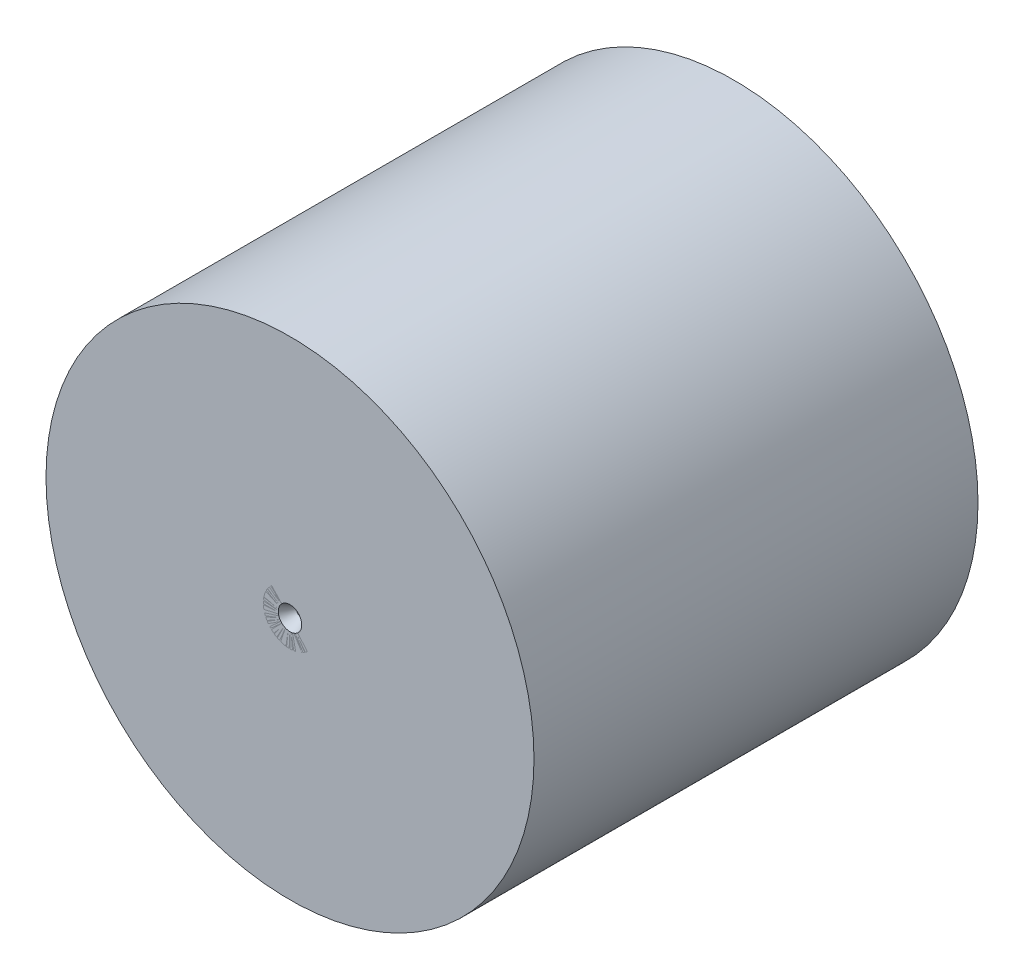
ISO-10303-21;
HEADER;
FILE_DESCRIPTION(('STEP AP214'),'2;1');
FILE_NAME('part.step','',(''),(''),'','','');
FILE_SCHEMA(('AUTOMOTIVE_DESIGN { 1 0 10303 214 1 1 1 1 }'));
ENDSEC;
DATA;
#1=APPLICATION_CONTEXT('core data for automotive mechanical design processes');
#2=APPLICATION_PROTOCOL_DEFINITION('international standard','automotive_design',2000,#1);
#3=PRODUCT_CONTEXT('',#1,'mechanical');
#4=PRODUCT('Part','Part','',(#3));
#5=PRODUCT_RELATED_PRODUCT_CATEGORY('part','',(#4));
#6=PRODUCT_DEFINITION_FORMATION('','',#4);
#7=PRODUCT_DEFINITION_CONTEXT('part definition',#1,'design');
#8=PRODUCT_DEFINITION('design','',#6,#7);
#9=PRODUCT_DEFINITION_SHAPE('','',#8);
#10=(LENGTH_UNIT() NAMED_UNIT(*) SI_UNIT(.MILLI.,.METRE.));
#11=(NAMED_UNIT(*) PLANE_ANGLE_UNIT() SI_UNIT($,.RADIAN.));
#12=(NAMED_UNIT(*) SI_UNIT($,.STERADIAN.) SOLID_ANGLE_UNIT());
#13=UNCERTAINTY_MEASURE_WITH_UNIT(LENGTH_MEASURE(1.E-05),#10,'distance_accuracy_value','');
#14=(GEOMETRIC_REPRESENTATION_CONTEXT(3) GLOBAL_UNCERTAINTY_ASSIGNED_CONTEXT((#13)) GLOBAL_UNIT_ASSIGNED_CONTEXT((#10,
#11,#12)) REPRESENTATION_CONTEXT('',''));
#15=CARTESIAN_POINT('',(0.,0.,0.));
#16=DIRECTION('',(0.,0.,1.));
#17=DIRECTION('',(1.,0.,0.));
#18=AXIS2_PLACEMENT_3D('',#15,#16,#17);
#19=CARTESIAN_POINT('',(0.,0.,-165.644610179245));
#20=DIRECTION('',(0.,0.,1.));
#21=DIRECTION('',(1.,0.,0.));
#22=AXIS2_PLACEMENT_3D('',#19,#20,#21);
#23=CYLINDRICAL_SURFACE('',#22,57.15);
#24=CARTESIAN_POINT('',(0.,0.,-2.));
#25=DIRECTION('',(0.,0.,1.));
#26=DIRECTION('',(1.,0.,0.));
#27=AXIS2_PLACEMENT_3D('',#24,#25,#26);
#28=CIRCLE('',#27,57.15);
#29=CARTESIAN_POINT('',(57.15,0.,-2.));
#30=VERTEX_POINT('',#29);
#31=EDGE_CURVE('E75',#30,#30,#28,.F.);
#32=CARTESIAN_POINT('',(0.,0.,101.9999996618));
#33=DIRECTION('',(0.,0.,1.));
#34=DIRECTION('',(1.,0.,0.));
#35=AXIS2_PLACEMENT_3D('',#32,#33,#34);
#36=CIRCLE('',#35,57.15);
#37=CARTESIAN_POINT('',(57.15,0.,101.9999996618));
#38=VERTEX_POINT('',#37);
#39=EDGE_CURVE('E14',#38,#38,#36,.F.);
#40=CARTESIAN_POINT('',(57.15,0.,-2.));
#41=CARTESIAN_POINT('',(57.15,0.,-0.91666667018958));
#42=CARTESIAN_POINT('',(57.15,0.,0.16666665962084));
#43=CARTESIAN_POINT('',(57.15,0.,2.33333331924167));
#44=CARTESIAN_POINT('',(57.15,0.,3.41666664905208));
#45=CARTESIAN_POINT('',(57.15,0.,5.58333330867291));
#46=CARTESIAN_POINT('',(57.15,0.,6.66666663848332));
#47=CARTESIAN_POINT('',(57.15,0.,8.83333329810415));
#48=CARTESIAN_POINT('',(57.15,0.,9.91666662791457));
#49=CARTESIAN_POINT('',(57.15,0.,12.0833332875354));
#50=CARTESIAN_POINT('',(57.15,0.,13.1666666173458));
#51=CARTESIAN_POINT('',(57.15,0.,15.3333332769667));
#52=CARTESIAN_POINT('',(57.15,0.,16.4166666067771));
#53=CARTESIAN_POINT('',(57.15,0.,18.5833332663979));
#54=CARTESIAN_POINT('',(57.15,0.,19.6666665962083));
#55=CARTESIAN_POINT('',(57.15,0.,21.8333332558291));
#56=CARTESIAN_POINT('',(57.15,0.,22.9166665856396));
#57=CARTESIAN_POINT('',(57.15,0.,25.0833332452604));
#58=CARTESIAN_POINT('',(57.15,0.,26.1666665750708));
#59=CARTESIAN_POINT('',(57.15,0.,28.3333332346917));
#60=CARTESIAN_POINT('',(57.15,0.,29.4166665645021));
#61=CARTESIAN_POINT('',(57.15,0.,31.5833332241229));
#62=CARTESIAN_POINT('',(57.15,0.,32.6666665539333));
#63=CARTESIAN_POINT('',(57.15,0.,34.8333332135541));
#64=CARTESIAN_POINT('',(57.15,0.,35.9166665433646));
#65=CARTESIAN_POINT('',(57.15,0.,38.0833332029854));
#66=CARTESIAN_POINT('',(57.15,0.,39.1666665327958));
#67=CARTESIAN_POINT('',(57.15,0.,41.3333331924167));
#68=CARTESIAN_POINT('',(57.15,0.,42.4166665222271));
#69=CARTESIAN_POINT('',(57.15,0.,44.5833331818479));
#70=CARTESIAN_POINT('',(57.15,0.,45.6666665116583));
#71=CARTESIAN_POINT('',(57.15,0.,47.8333331712791));
#72=CARTESIAN_POINT('',(57.15,0.,48.9166665010896));
#73=CARTESIAN_POINT('',(57.15,0.,51.0833331607104));
#74=CARTESIAN_POINT('',(57.15,0.,52.1666664905208));
#75=CARTESIAN_POINT('',(57.15,0.,54.3333331501417));
#76=CARTESIAN_POINT('',(57.15,0.,55.4166664799521));
#77=CARTESIAN_POINT('',(57.15,0.,57.5833331395729));
#78=CARTESIAN_POINT('',(57.15,0.,58.6666664693833));
#79=CARTESIAN_POINT('',(57.15,0.,60.8333331290041));
#80=CARTESIAN_POINT('',(57.15,0.,61.9166664588146));
#81=CARTESIAN_POINT('',(57.15,0.,64.0833331184354));
#82=CARTESIAN_POINT('',(57.15,0.,65.1666664482458));
#83=CARTESIAN_POINT('',(57.15,0.,67.3333331078666));
#84=CARTESIAN_POINT('',(57.15,0.,68.4166664376771));
#85=CARTESIAN_POINT('',(57.15,0.,70.5833330972979));
#86=CARTESIAN_POINT('',(57.15,0.,71.6666664271083));
#87=CARTESIAN_POINT('',(57.15,0.,73.8333330867291));
#88=CARTESIAN_POINT('',(57.15,0.,74.9166664165395));
#89=CARTESIAN_POINT('',(57.15,0.,77.0833330761604));
#90=CARTESIAN_POINT('',(57.15,0.,78.1666664059708));
#91=CARTESIAN_POINT('',(57.15,0.,80.3333330655916));
#92=CARTESIAN_POINT('',(57.15,0.,81.4166663954021));
#93=CARTESIAN_POINT('',(57.15,0.,83.5833330550229));
#94=CARTESIAN_POINT('',(57.15,0.,84.6666663848333));
#95=CARTESIAN_POINT('',(57.15,0.,86.8333330444541));
#96=CARTESIAN_POINT('',(57.15,0.,87.9166663742645));
#97=CARTESIAN_POINT('',(57.15,0.,90.0833330338854));
#98=CARTESIAN_POINT('',(57.15,0.,91.1666663636958));
#99=CARTESIAN_POINT('',(57.15,0.,93.3333330233166));
#100=CARTESIAN_POINT('',(57.15,0.,94.416666353127));
#101=CARTESIAN_POINT('',(57.15,0.,96.5833330127478));
#102=CARTESIAN_POINT('',(57.15,0.,97.6666663425582));
#103=CARTESIAN_POINT('',(57.15,0.,99.8333330021791));
#104=CARTESIAN_POINT('',(57.15,0.,100.91666633199));
#105=CARTESIAN_POINT('',(57.15,0.,101.9999996618));
#106=B_SPLINE_CURVE_WITH_KNOTS('',3,(#40,#41,#42,#43,#44,#45,#46,#47,#48,#49,#50,#51,#52,#53,
#54,#55,#56,#57,#58,#59,#60,#61,#62,#63,#64,#65,#66,#67,#68,#69,#70,#71,#72,#73,#74,#75,#76,#77,
#78,#79,#80,#81,#82,#83,#84,#85,#86,#87,#88,#89,#90,#91,#92,#93,#94,#95,#96,#97,#98,#99,#100,
#101,#102,#103,#104,#105),.UNSPECIFIED.,.F.,.F.,(4,2,2,2,2,2,2,2,2,2,2,2,2,2,2,2,2,2,2,2,2,2,2,
2,2,2,2,2,2,2,2,2,4),(0.,3.24999998943126,6.4999999788625,9.74999996829373,12.999999957725,
16.2499999471563,19.4999999365875,22.7499999260187,25.99999991545,29.2499999048813,
32.4999998943125,35.7499998837437,38.999999873175,42.2499998626062,45.4999998520375,
48.7499998414687,51.9999998309,55.2499998203312,58.4999998097625,61.7499997991937,
64.999999788625,68.2499997780562,71.4999997674875,74.7499997569187,77.99999974635,
81.2499997357812,84.4999997252125,87.7499997146437,90.9999997040749,94.2499996935062,
97.4999996829374,100.749999672369,103.9999996618),.UNSPECIFIED.);
#107=EDGE_CURVE('BSEAM68',#30,#38,#106,.T.);
#108=ORIENTED_EDGE('',*,*,#31,.F.);
#109=ORIENTED_EDGE('',*,*,#39,.T.);
#110=ORIENTED_EDGE('',*,*,#107,.T.);
#111=ORIENTED_EDGE('',*,*,#107,.F.);
#112=EDGE_LOOP('',(#108,#110,#109,#111));
#113=FACE_BOUND('',#112,.T.);
#114=ADVANCED_FACE('F68',(#113),#23,.T.);
#115=CARTESIAN_POINT('',(0.,0.,-2.));
#116=DIRECTION('',(0.,0.,1.));
#117=DIRECTION('',(1.,0.,0.));
#118=AXIS2_PLACEMENT_3D('',#115,#116,#117);
#119=PLANE('',#118);
#120=ORIENTED_EDGE('',*,*,#31,.T.);
#121=EDGE_LOOP('',(#120));
#122=FACE_BOUND('',#121,.T.);
#123=ADVANCED_FACE('F100',(#122),#119,.F.);
#124=CARTESIAN_POINT('',(0.,0.,101.9999996618));
#125=DIRECTION('',(0.,0.,1.));
#126=DIRECTION('',(1.,0.,0.));
#127=AXIS2_PLACEMENT_3D('',#124,#125,#126);
#128=PLANE('',#127);
#129=ORIENTED_EDGE('',*,*,#39,.F.);
#130=EDGE_LOOP('',(#129));
#131=FACE_BOUND('',#130,.T.);
#132=CARTESIAN_POINT('',(0.,0.,101.9999996618));
#133=DIRECTION('',(0.,0.,1.));
#134=DIRECTION('',(1.,0.,0.));
#135=AXIS2_PLACEMENT_3D('',#132,#133,#134);
#136=CIRCLE('',#135,2.75);
#137=CARTESIAN_POINT('',(2.75,0.,101.9999996618));
#138=VERTEX_POINT('',#137);
#139=EDGE_CURVE('E91',#138,#138,#136,.T.);
#140=ORIENTED_EDGE('',*,*,#139,.F.);
#141=EDGE_LOOP('',(#140));
#142=FACE_BOUND('',#141,.T.);
#143=ADVANCED_FACE('F70',(#131,#142),#128,.T.);
#144=CARTESIAN_POINT('',(0.,0.,96.9999996618));
#145=DIRECTION('',(0.,0.,1.));
#146=DIRECTION('',(1.,0.,0.));
#147=AXIS2_PLACEMENT_3D('',#144,#145,#146);
#148=CONICAL_SURFACE('',#147,1.19999999999999,1.02974425867665);
#149=CARTESIAN_POINT('',(0.,0.,96.2789669189669));
#150=VERTEX_POINT('',#149);
#151=VERTEX_LOOP('',#150);
#152=FACE_BOUND('',#151,.T.);
#153=CARTESIAN_POINT('',(0.,0.,96.9999996618));
#154=DIRECTION('',(0.,0.,1.));
#155=DIRECTION('',(1.,0.,0.));
#156=AXIS2_PLACEMENT_3D('',#153,#154,#155);
#157=CIRCLE('',#156,1.19999999999999);
#158=CARTESIAN_POINT('',(1.19999999999999,0.,96.9999996618));
#159=VERTEX_POINT('',#158);
#160=EDGE_CURVE('E85',#159,#159,#157,.T.);
#161=ORIENTED_EDGE('',*,*,#160,.T.);
#162=EDGE_LOOP('',(#161));
#163=FACE_BOUND('',#162,.T.);
#164=ADVANCED_FACE('F78',(#152,#163),#148,.F.);
#165=CARTESIAN_POINT('',(0.,0.,101.9999996618));
#166=DIRECTION('',(0.,0.,1.));
#167=DIRECTION('',(1.,0.,0.));
#168=AXIS2_PLACEMENT_3D('',#165,#166,#167);
#169=CYLINDRICAL_SURFACE('',#168,1.19999999999999);
#170=ORIENTED_EDGE('',*,*,#160,.F.);
#171=EDGE_LOOP('',(#170));
#172=FACE_BOUND('',#171,.T.);
#173=CARTESIAN_POINT('',(0.,0.,99.3153209100682));
#174=DIRECTION('',(0.,0.,1.));
#175=DIRECTION('',(1.,0.,0.));
#176=AXIS2_PLACEMENT_3D('',#173,#174,#175);
#177=CIRCLE('',#176,1.2);
#178=CARTESIAN_POINT('',(1.2,0.,99.3153209100682));
#179=VERTEX_POINT('',#178);
#180=EDGE_CURVE('E87',#179,#179,#177,.T.);
#181=ORIENTED_EDGE('',*,*,#180,.T.);
#182=EDGE_LOOP('',(#181));
#183=FACE_BOUND('',#182,.T.);
#184=ADVANCED_FACE('F81',(#172,#183),#169,.F.);
#185=CARTESIAN_POINT('',(0.,0.,101.9999996618));
#186=DIRECTION('',(0.,0.,1.));
#187=DIRECTION('',(1.,0.,0.));
#188=AXIS2_PLACEMENT_3D('',#185,#186,#187);
#189=CONICAL_SURFACE('',#188,2.75,0.523598775598297);
#190=ORIENTED_EDGE('',*,*,#180,.F.);
#191=EDGE_LOOP('',(#190));
#192=FACE_BOUND('',#191,.T.);
#193=ORIENTED_EDGE('',*,*,#139,.T.);
#194=EDGE_LOOP('',(#193));
#195=FACE_BOUND('',#194,.T.);
#196=ADVANCED_FACE('F97',(#192,#195),#189,.F.);
#197=CLOSED_SHELL('',(#114,#123,#143,#164,#184,#196));
#198=MANIFOLD_SOLID_BREP('B2_NOT_SHOWN',#197);
#199=CARTESIAN_POINT('',(0.,0.,101.9999996618));
#200=DIRECTION('',(0.,0.,1.));
#201=DIRECTION('',(1.,0.,0.));
#202=AXIS2_PLACEMENT_3D('',#199,#200,#201);
#203=PLANE('',#202);
#204=CARTESIAN_POINT('',(0.,0.,101.9999996618));
#205=DIRECTION('',(0.,0.,1.));
#206=DIRECTION('',(1.,0.,0.));
#207=AXIS2_PLACEMENT_3D('',#204,#205,#206);
#208=CIRCLE('',#207,2.75);
#209=CARTESIAN_POINT('',(2.75,0.,101.9999996618));
#210=VERTEX_POINT('',#209);
#211=EDGE_CURVE('E198',#210,#210,#208,.T.);
#212=ORIENTED_EDGE('',*,*,#211,.F.);
#213=EDGE_LOOP('',(#212));
#214=FACE_BOUND('',#213,.T.);
#215=CARTESIAN_POINT('',(0.,0.,101.9999996618));
#216=DIRECTION('',(0.,0.,1.));
#217=DIRECTION('',(1.,0.,0.));
#218=AXIS2_PLACEMENT_3D('',#215,#216,#217);
#219=CIRCLE('',#218,6.24999997775);
#220=CARTESIAN_POINT('',(6.24999997775,0.,101.9999996618));
#221=VERTEX_POINT('',#220);
#222=EDGE_CURVE('E66',#221,#221,#219,.T.);
#223=ORIENTED_EDGE('',*,*,#222,.T.);
#224=EDGE_LOOP('',(#223));
#225=FACE_BOUND('',#224,.T.);
#226=ADVANCED_FACE('F172',(#214,#225),#203,.T.);
#227=CARTESIAN_POINT('',(0.,0.,24.999999911));
#228=DIRECTION('',(0.,0.,1.));
#229=DIRECTION('',(1.,0.,0.));
#230=AXIS2_PLACEMENT_3D('',#227,#228,#229);
#231=PLANE('',#230);
#232=CARTESIAN_POINT('',(0.,0.,24.999999911));
#233=DIRECTION('',(0.,0.,1.));
#234=DIRECTION('',(1.,0.,0.));
#235=AXIS2_PLACEMENT_3D('',#232,#233,#234);
#236=CIRCLE('',#235,26.8114435458671);
#237=CARTESIAN_POINT('',(26.8114435458671,0.,24.999999911));
#238=VERTEX_POINT('',#237);
#239=EDGE_CURVE('E203',#238,#238,#236,.T.);
#240=ORIENTED_EDGE('',*,*,#239,.F.);
#241=EDGE_LOOP('',(#240));
#242=FACE_BOUND('',#241,.T.);
#243=CARTESIAN_POINT('',(0.,0.,24.9999999110001));
#244=DIRECTION('',(0.,0.,-1.));
#245=DIRECTION('',(-1.,0.,0.));
#246=AXIS2_PLACEMENT_3D('',#243,#244,#245);
#247=CIRCLE('',#246,28.7499998976501);
#248=CARTESIAN_POINT('',(-28.7499998976501,0.,24.9999999110001));
#249=VERTEX_POINT('',#248);
#250=EDGE_CURVE('E215',#249,#249,#247,.T.);
#251=ORIENTED_EDGE('',*,*,#250,.F.);
#252=EDGE_LOOP('',(#251));
#253=FACE_BOUND('',#252,.T.);
#254=ADVANCED_FACE('F242',(#242,#253),#231,.T.);
#255=CARTESIAN_POINT('',(0.,0.,23.7499999154499));
#256=DIRECTION('',(0.,0.,-1.));
#257=DIRECTION('',(-1.,0.,0.));
#258=AXIS2_PLACEMENT_3D('',#255,#256,#257);
#259=CONICAL_SURFACE('',#258,29.9999998931999,0.7853981633973);
#260=CARTESIAN_POINT('',(0.,0.,23.74999991545));
#261=DIRECTION('',(0.,0.,1.));
#262=DIRECTION('',(1.,0.,0.));
#263=AXIS2_PLACEMENT_3D('',#260,#261,#262);
#264=CIRCLE('',#263,29.9999998932);
#265=CARTESIAN_POINT('',(29.9999998932,0.,23.74999991545));
#266=VERTEX_POINT('',#265);
#267=EDGE_CURVE('E210',#266,#266,#264,.F.);
#268=ORIENTED_EDGE('',*,*,#267,.F.);
#269=EDGE_LOOP('',(#268));
#270=FACE_BOUND('',#269,.T.);
#271=ORIENTED_EDGE('',*,*,#250,.T.);
#272=EDGE_LOOP('',(#271));
#273=FACE_BOUND('',#272,.T.);
#274=ADVANCED_FACE('F398',(#270,#273),#259,.T.);
#275=CARTESIAN_POINT('',(0.,0.,4.9999999822));
#276=DIRECTION('',(0.,0.,1.));
#277=DIRECTION('',(1.,0.,0.));
#278=AXIS2_PLACEMENT_3D('',#275,#276,#277);
#279=CYLINDRICAL_SURFACE('',#278,29.9999998932);
#280=CARTESIAN_POINT('',(0.,0.,12.74999996173));
#281=DIRECTION('',(0.,0.,1.));
#282=DIRECTION('',(1.,0.,0.));
#283=AXIS2_PLACEMENT_3D('',#280,#281,#282);
#284=CIRCLE('',#283,29.9999998932);
#285=CARTESIAN_POINT('',(29.9999998932,0.,12.74999996173));
#286=VERTEX_POINT('',#285);
#287=EDGE_CURVE('E214',#286,#286,#284,.T.);
#288=ORIENTED_EDGE('',*,*,#287,.T.);
#289=EDGE_LOOP('',(#288));
#290=FACE_BOUND('',#289,.T.);
#291=ORIENTED_EDGE('',*,*,#267,.T.);
#292=EDGE_LOOP('',(#291));
#293=FACE_BOUND('',#292,.T.);
#294=ADVANCED_FACE('F408',(#290,#293),#279,.T.);
#295=CARTESIAN_POINT('',(-51.874999815325,-6.30476008401506,10.74999996173));
#296=DIRECTION('',(0.,0.,1.));
#297=DIRECTION('',(1.,0.,0.));
#298=AXIS2_PLACEMENT_3D('',#295,#296,#297);
#299=PLANE('',#298);
#300=CARTESIAN_POINT('',(0.,0.,10.74999996173));
#301=DIRECTION('',(0.,0.,1.));
#302=DIRECTION('',(1.,0.,0.));
#303=AXIS2_PLACEMENT_3D('',#300,#301,#302);
#304=CIRCLE('',#303,31.9999998932);
#305=CARTESIAN_POINT('',(31.9999998932,0.,10.74999996173));
#306=VERTEX_POINT('',#305);
#307=EDGE_CURVE('E178',#306,#306,#304,.F.);
#308=ORIENTED_EDGE('',*,*,#307,.T.);
#309=EDGE_LOOP('',(#308));
#310=FACE_BOUND('',#309,.T.);
#311=CARTESIAN_POINT('',(0.,0.,10.74999996173));
#312=DIRECTION('',(0.,0.,1.));
#313=DIRECTION('',(1.,0.,0.));
#314=AXIS2_PLACEMENT_3D('',#311,#312,#313);
#315=CIRCLE('',#314,57.15);
#316=CARTESIAN_POINT('',(57.15,0.,10.74999996173));
#317=VERTEX_POINT('',#316);
#318=EDGE_CURVE('E191',#317,#317,#315,.T.);
#319=ORIENTED_EDGE('',*,*,#318,.T.);
#320=EDGE_LOOP('',(#319));
#321=FACE_BOUND('',#320,.T.);
#322=ADVANCED_FACE('F403',(#310,#321),#299,.T.);
#323=CARTESIAN_POINT('',(0.,0.,12.74999996173));
#324=DIRECTION('',(0.,0.,1.));
#325=DIRECTION('',(1.,0.,0.));
#326=AXIS2_PLACEMENT_3D('',#323,#324,#325);
#327=TOROIDAL_SURFACE('',#326,31.9999998932,2.);
#328=ORIENTED_EDGE('',*,*,#307,.F.);
#329=EDGE_LOOP('',(#328));
#330=FACE_BOUND('',#329,.T.);
#331=ORIENTED_EDGE('',*,*,#287,.F.);
#332=EDGE_LOOP('',(#331));
#333=FACE_BOUND('',#332,.T.);
#334=ADVANCED_FACE('F250',(#330,#333),#327,.F.);
#335=CARTESIAN_POINT('',(0.,0.,130.834213982932));
#336=DIRECTION('',(0.,0.,-1.));
#337=DIRECTION('',(-1.,0.,0.));
#338=AXIS2_PLACEMENT_3D('',#335,#336,#337);
#339=CYLINDRICAL_SURFACE('',#338,26.8114435458671);
#340=ORIENTED_EDGE('',*,*,#239,.T.);
#341=EDGE_LOOP('',(#340));
#342=FACE_BOUND('',#341,.T.);
#343=CARTESIAN_POINT('',(0.,0.,54.9999998042));
#344=DIRECTION('',(0.,0.,1.));
#345=DIRECTION('',(1.,0.,0.));
#346=AXIS2_PLACEMENT_3D('',#343,#344,#345);
#347=CIRCLE('',#346,26.8114435458671);
#348=CARTESIAN_POINT('',(26.8114435458671,0.,54.9999998042));
#349=VERTEX_POINT('',#348);
#350=EDGE_CURVE('E206',#349,#349,#347,.T.);
#351=ORIENTED_EDGE('',*,*,#350,.F.);
#352=EDGE_LOOP('',(#351));
#353=FACE_BOUND('',#352,.T.);
#354=ADVANCED_FACE('F454',(#342,#353),#339,.T.);
#355=CARTESIAN_POINT('',(0.,0.,54.9999998042));
#356=DIRECTION('',(0.,0.,1.));
#357=DIRECTION('',(1.,0.,0.));
#358=AXIS2_PLACEMENT_3D('',#355,#356,#357);
#359=CYLINDRICAL_SURFACE('',#358,6.24999997775);
#360=ORIENTED_EDGE('',*,*,#222,.F.);
#361=EDGE_LOOP('',(#360));
#362=FACE_BOUND('',#361,.T.);
#363=CARTESIAN_POINT('',(0.,0.,55.9999998042));
#364=DIRECTION('',(0.,0.,1.));
#365=DIRECTION('',(1.,0.,0.));
#366=AXIS2_PLACEMENT_3D('',#363,#364,#365);
#367=CIRCLE('',#366,6.24999997775);
#368=CARTESIAN_POINT('',(6.24999997775,0.,55.9999998042));
#369=VERTEX_POINT('',#368);
#370=EDGE_CURVE('E209',#369,#369,#367,.T.);
#371=ORIENTED_EDGE('',*,*,#370,.T.);
#372=EDGE_LOOP('',(#371));
#373=FACE_BOUND('',#372,.T.);
#374=ADVANCED_FACE('F248',(#362,#373),#359,.T.);
#375=CARTESIAN_POINT('',(0.,0.,55.9999998042));
#376=DIRECTION('',(0.,0.,1.));
#377=DIRECTION('',(1.,0.,0.));
#378=AXIS2_PLACEMENT_3D('',#375,#376,#377);
#379=TOROIDAL_SURFACE('',#378,7.24999997775,1.);
#380=ORIENTED_EDGE('',*,*,#370,.F.);
#381=EDGE_LOOP('',(#380));
#382=FACE_BOUND('',#381,.T.);
#383=CARTESIAN_POINT('',(0.,0.,54.9999998042));
#384=DIRECTION('',(0.,0.,1.));
#385=DIRECTION('',(1.,0.,0.));
#386=AXIS2_PLACEMENT_3D('',#383,#384,#385);
#387=CIRCLE('',#386,7.24999997775);
#388=CARTESIAN_POINT('',(7.24999997775,0.,54.9999998042));
#389=VERTEX_POINT('',#388);
#390=EDGE_CURVE('E222',#389,#389,#387,.F.);
#391=ORIENTED_EDGE('',*,*,#390,.F.);
#392=EDGE_LOOP('',(#391));
#393=FACE_BOUND('',#392,.T.);
#394=ADVANCED_FACE('F241',(#382,#393),#379,.F.);
#395=CARTESIAN_POINT('',(0.,0.,54.9999998042));
#396=DIRECTION('',(0.,0.,1.));
#397=DIRECTION('',(1.,0.,0.));
#398=AXIS2_PLACEMENT_3D('',#395,#396,#397);
#399=PLANE('',#398);
#400=ORIENTED_EDGE('',*,*,#390,.T.);
#401=EDGE_LOOP('',(#400));
#402=FACE_BOUND('',#401,.T.);
#403=ORIENTED_EDGE('',*,*,#350,.T.);
#404=EDGE_LOOP('',(#403));
#405=FACE_BOUND('',#404,.T.);
#406=ADVANCED_FACE('F230',(#402,#405),#399,.T.);
#407=CARTESIAN_POINT('',(0.,0.,-165.644610179245));
#408=DIRECTION('',(0.,0.,1.));
#409=DIRECTION('',(1.,0.,0.));
#410=AXIS2_PLACEMENT_3D('',#407,#408,#409);
#411=CYLINDRICAL_SURFACE('',#410,57.15);
#412=CARTESIAN_POINT('',(0.,0.,-2.));
#413=DIRECTION('',(0.,0.,1.));
#414=DIRECTION('',(1.,0.,0.));
#415=AXIS2_PLACEMENT_3D('',#412,#413,#414);
#416=CIRCLE('',#415,57.15);
#417=CARTESIAN_POINT('',(57.15,0.,-2.));
#418=VERTEX_POINT('',#417);
#419=EDGE_CURVE('E195',#418,#418,#416,.F.);
#420=CARTESIAN_POINT('',(57.15,0.,-2.));
#421=CARTESIAN_POINT('',(57.15,0.,-1.86718750039865));
#422=CARTESIAN_POINT('',(57.15,0.,-1.7343750007973));
#423=CARTESIAN_POINT('',(57.15,0.,-1.46875000159459));
#424=CARTESIAN_POINT('',(57.15,0.,-1.33593750199324));
#425=CARTESIAN_POINT('',(57.15,0.,-1.07031250279053));
#426=CARTESIAN_POINT('',(57.15,0.,-0.93750000318917));
#427=CARTESIAN_POINT('',(57.15,0.,-0.671875003986457));
#428=CARTESIAN_POINT('',(57.15,0.,-0.539062504385105));
#429=CARTESIAN_POINT('',(57.15,0.,-0.273437505182402));
#430=CARTESIAN_POINT('',(57.15,0.,-0.14062500558105));
#431=CARTESIAN_POINT('',(57.15,0.,0.124999993621662));
#432=CARTESIAN_POINT('',(57.15,0.,0.257812493223023));
#433=CARTESIAN_POINT('',(57.15,0.,0.523437492425736));
#434=CARTESIAN_POINT('',(57.15,0.,0.656249992027088));
#435=CARTESIAN_POINT('',(57.15,0.,0.921874991229791));
#436=CARTESIAN_POINT('',(57.15,0.,1.05468749083114));
#437=CARTESIAN_POINT('',(57.15,0.,1.32031249003385));
#438=CARTESIAN_POINT('',(57.15,0.,1.4531249896352));
#439=CARTESIAN_POINT('',(57.15,0.,1.7187499888379));
#440=CARTESIAN_POINT('',(57.15,0.,1.85156248843925));
#441=CARTESIAN_POINT('',(57.15,0.,2.11718748764197));
#442=CARTESIAN_POINT('',(57.15,0.,2.24999998724333));
#443=CARTESIAN_POINT('',(57.15,0.,2.51562498644604));
#444=CARTESIAN_POINT('',(57.15,0.,2.64843748604739));
#445=CARTESIAN_POINT('',(57.15,0.,2.91406248525009));
#446=CARTESIAN_POINT('',(57.15,0.,3.04687498485145));
#447=CARTESIAN_POINT('',(57.15,0.,3.31249998405416));
#448=CARTESIAN_POINT('',(57.15,0.,3.44531248365552));
#449=CARTESIAN_POINT('',(57.15,0.,3.71093748285823));
#450=CARTESIAN_POINT('',(57.15,0.,3.84374998245958));
#451=CARTESIAN_POINT('',(57.15,0.,4.10937498166229));
#452=CARTESIAN_POINT('',(57.15,0.,4.24218748126364));
#453=CARTESIAN_POINT('',(57.15,0.,4.50781248046634));
#454=CARTESIAN_POINT('',(57.15,0.,4.64062498006769));
#455=CARTESIAN_POINT('',(57.15,0.,4.9062499792704));
#456=CARTESIAN_POINT('',(57.15,0.,5.03906247887175));
#457=CARTESIAN_POINT('',(57.15,0.,5.30468747807446));
#458=CARTESIAN_POINT('',(57.15,0.,5.43749997767582));
#459=CARTESIAN_POINT('',(57.15,0.,5.70312497687854));
#460=CARTESIAN_POINT('',(57.15,0.,5.83593747647989));
#461=CARTESIAN_POINT('',(57.15,0.,6.10156247568259));
#462=CARTESIAN_POINT('',(57.15,0.,6.23437497528394));
#463=CARTESIAN_POINT('',(57.15,0.,6.49999997448665));
#464=CARTESIAN_POINT('',(57.15,0.,6.63281247408802));
#465=CARTESIAN_POINT('',(57.15,0.,6.89843747329073));
#466=CARTESIAN_POINT('',(57.15,0.,7.03124997289208));
#467=CARTESIAN_POINT('',(57.15,0.,7.29687497209478));
#468=CARTESIAN_POINT('',(57.15,0.,7.42968747169613));
#469=CARTESIAN_POINT('',(57.15,0.,7.69531247089884));
#470=CARTESIAN_POINT('',(57.15,0.,7.82812497050019));
#471=CARTESIAN_POINT('',(57.15,0.,8.09374996970289));
#472=CARTESIAN_POINT('',(57.15,0.,8.22656246930425));
#473=CARTESIAN_POINT('',(57.15,0.,8.49218746850696));
#474=CARTESIAN_POINT('',(57.15,0.,8.62499996810832));
#475=CARTESIAN_POINT('',(57.15,0.,8.89062496731103));
#476=CARTESIAN_POINT('',(57.15,0.,9.02343746691238));
#477=CARTESIAN_POINT('',(57.15,0.,9.28906246611509));
#478=CARTESIAN_POINT('',(57.15,0.,9.42187496571644));
#479=CARTESIAN_POINT('',(57.15,0.,9.68749996491915));
#480=CARTESIAN_POINT('',(57.15,0.,9.82031246452051));
#481=CARTESIAN_POINT('',(57.15,0.,10.0859374637232));
#482=CARTESIAN_POINT('',(57.15,0.,10.2187499633246));
#483=CARTESIAN_POINT('',(57.15,0.,10.4843749625273));
#484=CARTESIAN_POINT('',(57.15,0.,10.6171874621286));
#485=CARTESIAN_POINT('',(57.15,0.,10.74999996173));
#486=B_SPLINE_CURVE_WITH_KNOTS('',3,(#420,#421,#422,#423,#424,#425,#426,#427,#428,#429,#430,
#431,#432,#433,#434,#435,#436,#437,#438,#439,#440,#441,#442,#443,#444,#445,#446,#447,#448,#449,
#450,#451,#452,#453,#454,#455,#456,#457,#458,#459,#460,#461,#462,#463,#464,#465,#466,#467,#468,
#469,#470,#471,#472,#473,#474,#475,#476,#477,#478,#479,#480,#481,#482,#483,#484,#485),
.UNSPECIFIED.,.F.,.F.,(4,2,2,2,2,2,2,2,2,2,2,2,2,2,2,2,2,2,2,2,2,2,2,2,2,2,2,2,2,2,2,2,4),(0.,
0.398437498804055,0.79687499760811,1.19531249641219,1.59374999521625,1.9921874940203,
2.39062499282439,2.78906249162844,3.1874999904325,3.58593748923655,3.98437498804061,
4.38281248684469,4.78124998564874,5.1796874844528,5.57812498325688,5.97656248206094,
6.37499998086499,6.77343747966905,7.1718749784731,7.57031247727719,7.96874997608124,
8.3671874748853,8.76562497368938,9.16406247249343,9.56249997129749,9.96093747010154,
10.3593749689056,10.7578124677097,11.1562499665137,11.5546874653178,11.9531249641219,
12.3515624629259,12.74999996173),.UNSPECIFIED.);
#487=EDGE_CURVE('BSEAM240',#418,#317,#486,.T.);
#488=ORIENTED_EDGE('',*,*,#419,.F.);
#489=ORIENTED_EDGE('',*,*,#318,.F.);
#490=ORIENTED_EDGE('',*,*,#487,.T.);
#491=ORIENTED_EDGE('',*,*,#487,.F.);
#492=EDGE_LOOP('',(#488,#490,#489,#491));
#493=FACE_BOUND('',#492,.T.);
#494=ADVANCED_FACE('F240',(#493),#411,.T.);
#495=CARTESIAN_POINT('',(0.,0.,-2.));
#496=DIRECTION('',(0.,0.,1.));
#497=DIRECTION('',(1.,0.,0.));
#498=AXIS2_PLACEMENT_3D('',#495,#496,#497);
#499=PLANE('',#498);
#500=ORIENTED_EDGE('',*,*,#419,.T.);
#501=EDGE_LOOP('',(#500));
#502=FACE_BOUND('',#501,.T.);
#503=ADVANCED_FACE('F185',(#502),#499,.F.);
#504=CARTESIAN_POINT('',(0.,0.,96.9999996618));
#505=DIRECTION('',(0.,0.,1.));
#506=DIRECTION('',(1.,0.,0.));
#507=AXIS2_PLACEMENT_3D('',#504,#505,#506);
#508=CONICAL_SURFACE('',#507,1.19999999999999,1.02974425867665);
#509=CARTESIAN_POINT('',(0.,0.,96.2789669189669));
#510=VERTEX_POINT('',#509);
#511=VERTEX_LOOP('',#510);
#512=FACE_BOUND('',#511,.T.);
#513=CARTESIAN_POINT('',(0.,0.,96.9999996618));
#514=DIRECTION('',(0.,0.,1.));
#515=DIRECTION('',(1.,0.,0.));
#516=AXIS2_PLACEMENT_3D('',#513,#514,#515);
#517=CIRCLE('',#516,1.19999999999999);
#518=CARTESIAN_POINT('',(1.19999999999999,0.,96.9999996618));
#519=VERTEX_POINT('',#518);
#520=EDGE_CURVE('E189',#519,#519,#517,.T.);
#521=ORIENTED_EDGE('',*,*,#520,.T.);
#522=EDGE_LOOP('',(#521));
#523=FACE_BOUND('',#522,.T.);
#524=ADVANCED_FACE('F181',(#512,#523),#508,.F.);
#525=CARTESIAN_POINT('',(0.,0.,101.9999996618));
#526=DIRECTION('',(0.,0.,1.));
#527=DIRECTION('',(1.,0.,0.));
#528=AXIS2_PLACEMENT_3D('',#525,#526,#527);
#529=CYLINDRICAL_SURFACE('',#528,1.19999999999999);
#530=ORIENTED_EDGE('',*,*,#520,.F.);
#531=EDGE_LOOP('',(#530));
#532=FACE_BOUND('',#531,.T.);
#533=CARTESIAN_POINT('',(0.,0.,99.3153209100682));
#534=DIRECTION('',(0.,0.,1.));
#535=DIRECTION('',(1.,0.,0.));
#536=AXIS2_PLACEMENT_3D('',#533,#534,#535);
#537=CIRCLE('',#536,1.2);
#538=CARTESIAN_POINT('',(1.2,0.,99.3153209100682));
#539=VERTEX_POINT('',#538);
#540=EDGE_CURVE('E192',#539,#539,#537,.T.);
#541=ORIENTED_EDGE('',*,*,#540,.T.);
#542=EDGE_LOOP('',(#541));
#543=FACE_BOUND('',#542,.T.);
#544=ADVANCED_FACE('F184',(#532,#543),#529,.F.);
#545=CARTESIAN_POINT('',(0.,0.,101.9999996618));
#546=DIRECTION('',(0.,0.,1.));
#547=DIRECTION('',(1.,0.,0.));
#548=AXIS2_PLACEMENT_3D('',#545,#546,#547);
#549=CONICAL_SURFACE('',#548,2.75,0.523598775598297);
#550=ORIENTED_EDGE('',*,*,#540,.F.);
#551=EDGE_LOOP('',(#550));
#552=FACE_BOUND('',#551,.T.);
#553=ORIENTED_EDGE('',*,*,#211,.T.);
#554=EDGE_LOOP('',(#553));
#555=FACE_BOUND('',#554,.T.);
#556=ADVANCED_FACE('F437',(#552,#555),#549,.F.);
#557=CLOSED_SHELL('',(#226,#254,#274,#294,#322,#334,#354,#374,#394,#406,#494,#503,#524,#544,#556));
#558=MANIFOLD_SOLID_BREP('B8',#557);
#559=ADVANCED_BREP_SHAPE_REPRESENTATION('',(#18,#198,#558),#14);
#560=SHAPE_DEFINITION_REPRESENTATION(#9,#559);
ENDSEC;
END-ISO-10303-21;
